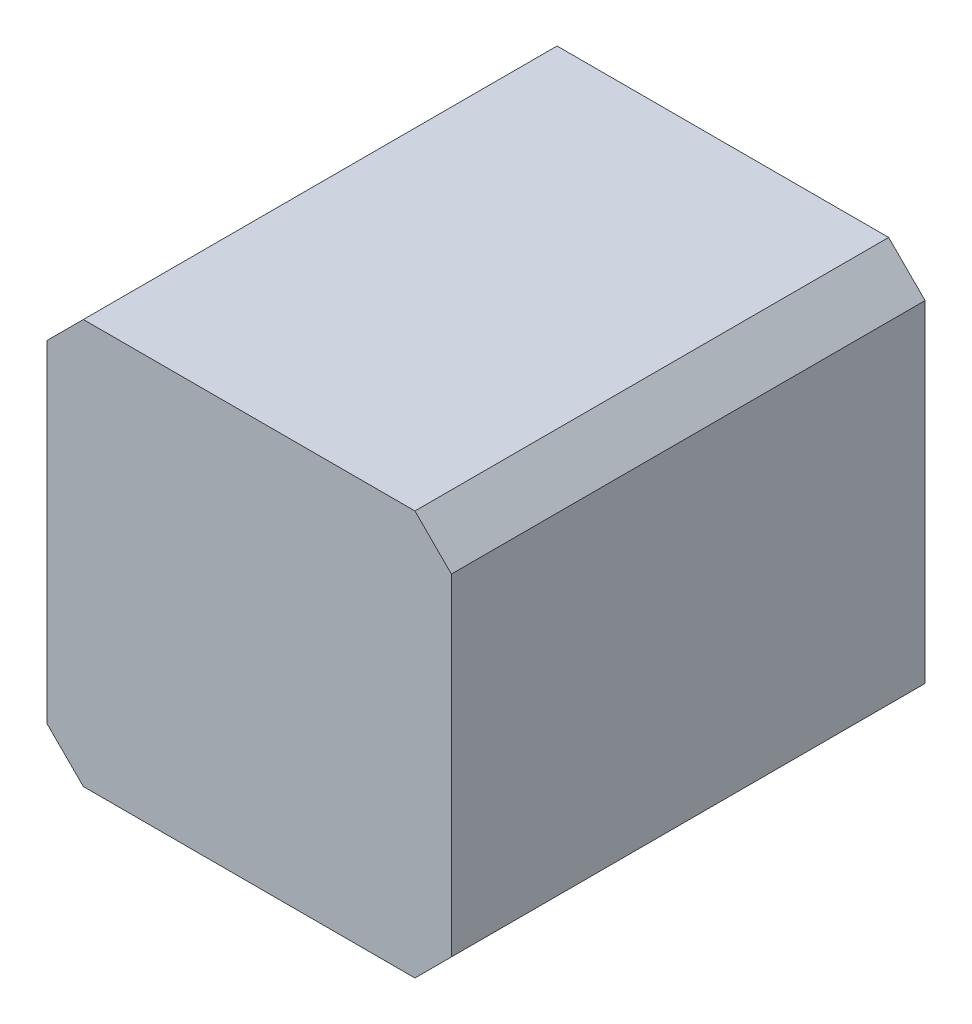
ISO-10303-21;
HEADER;
FILE_DESCRIPTION(('STEP AP214'),'2;1');
FILE_NAME('part.step','',(''),(''),'','','');
FILE_SCHEMA(('AUTOMOTIVE_DESIGN { 1 0 10303 214 1 1 1 1 }'));
ENDSEC;
DATA;
#1=APPLICATION_CONTEXT('core data for automotive mechanical design processes');
#2=APPLICATION_PROTOCOL_DEFINITION('international standard','automotive_design',2000,#1);
#3=PRODUCT_CONTEXT('',#1,'mechanical');
#4=PRODUCT('Part','Part','',(#3));
#5=PRODUCT_RELATED_PRODUCT_CATEGORY('part','',(#4));
#6=PRODUCT_DEFINITION_FORMATION('','',#4);
#7=PRODUCT_DEFINITION_CONTEXT('part definition',#1,'design');
#8=PRODUCT_DEFINITION('design','',#6,#7);
#9=PRODUCT_DEFINITION_SHAPE('','',#8);
#10=(LENGTH_UNIT() NAMED_UNIT(*) SI_UNIT(.MILLI.,.METRE.));
#11=(NAMED_UNIT(*) PLANE_ANGLE_UNIT() SI_UNIT($,.RADIAN.));
#12=(NAMED_UNIT(*) SI_UNIT($,.STERADIAN.) SOLID_ANGLE_UNIT());
#13=UNCERTAINTY_MEASURE_WITH_UNIT(LENGTH_MEASURE(1.E-05),#10,'distance_accuracy_value','');
#14=(GEOMETRIC_REPRESENTATION_CONTEXT(3) GLOBAL_UNCERTAINTY_ASSIGNED_CONTEXT((#13)) GLOBAL_UNIT_ASSIGNED_CONTEXT((#10,
#11,#12)) REPRESENTATION_CONTEXT('',''));
#15=CARTESIAN_POINT('',(0.,0.,0.));
#16=DIRECTION('',(0.,0.,1.));
#17=DIRECTION('',(1.,0.,0.));
#18=AXIS2_PLACEMENT_3D('',#15,#16,#17);
#19=CARTESIAN_POINT('',(-14.097,-14.097,33.02));
#20=DIRECTION('',(1.,0.,0.));
#21=DIRECTION('',(0.,0.,-1.));
#22=AXIS2_PLACEMENT_3D('',#19,#20,#21);
#23=PLANE('',#22);
#24=DIRECTION('',(0.,-1.,0.));
#25=VECTOR('',#24,1.);
#26=CARTESIAN_POINT('',(-14.097,-14.097,33.02));
#27=LINE('',#26,#25);
#28=CARTESIAN_POINT('',(-14.097,11.557,33.02));
#29=VERTEX_POINT('',#28);
#30=CARTESIAN_POINT('',(-14.097,-11.557,33.02));
#31=VERTEX_POINT('',#30);
#32=EDGE_CURVE('E134',#29,#31,#27,.T.);
#33=ORIENTED_EDGE('',*,*,#32,.F.);
#34=DIRECTION('',(0.,0.,-1.));
#35=VECTOR('',#34,1.);
#36=CARTESIAN_POINT('',(-14.097,11.557,33.02));
#37=LINE('',#36,#35);
#38=CARTESIAN_POINT('',(-14.097,11.557,0.));
#39=VERTEX_POINT('',#38);
#40=EDGE_CURVE('E161',#29,#39,#37,.T.);
#41=ORIENTED_EDGE('',*,*,#40,.T.);
#42=DIRECTION('',(0.,-1.,0.));
#43=VECTOR('',#42,1.);
#44=CARTESIAN_POINT('',(-14.097,-14.097,0.));
#45=LINE('',#44,#43);
#46=CARTESIAN_POINT('',(-14.097,-11.557,0.));
#47=VERTEX_POINT('',#46);
#48=EDGE_CURVE('E167',#39,#47,#45,.T.);
#49=ORIENTED_EDGE('',*,*,#48,.T.);
#50=DIRECTION('',(0.,0.,1.));
#51=VECTOR('',#50,1.);
#52=CARTESIAN_POINT('',(-14.097,-11.557,33.02));
#53=LINE('',#52,#51);
#54=EDGE_CURVE('E159',#47,#31,#53,.T.);
#55=ORIENTED_EDGE('',*,*,#54,.T.);
#56=EDGE_LOOP('',(#33,#41,#49,#55));
#57=FACE_BOUND('',#56,.T.);
#58=ADVANCED_FACE('F41',(#57),#23,.F.);
#59=CARTESIAN_POINT('',(14.097,-14.097,33.02));
#60=DIRECTION('',(0.,1.,0.));
#61=DIRECTION('',(-1.,0.,0.));
#62=AXIS2_PLACEMENT_3D('',#59,#60,#61);
#63=PLANE('',#62);
#64=DIRECTION('',(1.,0.,0.));
#65=VECTOR('',#64,1.);
#66=CARTESIAN_POINT('',(14.097,-14.097,33.02));
#67=LINE('',#66,#65);
#68=CARTESIAN_POINT('',(-11.557,-14.097,33.02));
#69=VERTEX_POINT('',#68);
#70=CARTESIAN_POINT('',(11.557,-14.097,33.02));
#71=VERTEX_POINT('',#70);
#72=EDGE_CURVE('E137',#69,#71,#67,.T.);
#73=ORIENTED_EDGE('',*,*,#72,.F.);
#74=DIRECTION('',(0.,0.,-1.));
#75=VECTOR('',#74,1.);
#76=CARTESIAN_POINT('',(-11.557,-14.097,33.02));
#77=LINE('',#76,#75);
#78=CARTESIAN_POINT('',(-11.557,-14.097,0.));
#79=VERTEX_POINT('',#78);
#80=EDGE_CURVE('E11',#69,#79,#77,.T.);
#81=ORIENTED_EDGE('',*,*,#80,.T.);
#82=DIRECTION('',(1.,0.,0.));
#83=VECTOR('',#82,1.);
#84=CARTESIAN_POINT('',(14.097,-14.097,0.));
#85=LINE('',#84,#83);
#86=CARTESIAN_POINT('',(11.557,-14.097,0.));
#87=VERTEX_POINT('',#86);
#88=EDGE_CURVE('E139',#79,#87,#85,.T.);
#89=ORIENTED_EDGE('',*,*,#88,.T.);
#90=DIRECTION('',(0.,0.,1.));
#91=VECTOR('',#90,1.);
#92=CARTESIAN_POINT('',(11.557,-14.097,33.02));
#93=LINE('',#92,#91);
#94=EDGE_CURVE('E50',#87,#71,#93,.T.);
#95=ORIENTED_EDGE('',*,*,#94,.T.);
#96=EDGE_LOOP('',(#73,#81,#89,#95));
#97=FACE_BOUND('',#96,.T.);
#98=ADVANCED_FACE('F221',(#97),#63,.F.);
#99=CARTESIAN_POINT('',(14.097,-14.097,33.02));
#100=DIRECTION('',(-1.,0.,0.));
#101=DIRECTION('',(0.,0.,1.));
#102=AXIS2_PLACEMENT_3D('',#99,#100,#101);
#103=PLANE('',#102);
#104=DIRECTION('',(0.,1.,0.));
#105=VECTOR('',#104,1.);
#106=CARTESIAN_POINT('',(14.097,-14.097,0.));
#107=LINE('',#106,#105);
#108=CARTESIAN_POINT('',(14.097,-11.557,0.));
#109=VERTEX_POINT('',#108);
#110=CARTESIAN_POINT('',(14.097,11.557,0.));
#111=VERTEX_POINT('',#110);
#112=EDGE_CURVE('E135',#109,#111,#107,.T.);
#113=ORIENTED_EDGE('',*,*,#112,.T.);
#114=DIRECTION('',(0.,0.,1.));
#115=VECTOR('',#114,1.);
#116=CARTESIAN_POINT('',(14.097,11.557,33.02));
#117=LINE('',#116,#115);
#118=CARTESIAN_POINT('',(14.097,11.557,33.02));
#119=VERTEX_POINT('',#118);
#120=EDGE_CURVE('E113',#111,#119,#117,.T.);
#121=ORIENTED_EDGE('',*,*,#120,.T.);
#122=DIRECTION('',(0.,1.,0.));
#123=VECTOR('',#122,1.);
#124=CARTESIAN_POINT('',(14.097,-14.097,33.02));
#125=LINE('',#124,#123);
#126=CARTESIAN_POINT('',(14.097,-11.557,33.02));
#127=VERTEX_POINT('',#126);
#128=EDGE_CURVE('E179',#127,#119,#125,.T.);
#129=ORIENTED_EDGE('',*,*,#128,.F.);
#130=DIRECTION('',(0.,0.,-1.));
#131=VECTOR('',#130,1.);
#132=CARTESIAN_POINT('',(14.097,-11.557,33.02));
#133=LINE('',#132,#131);
#134=EDGE_CURVE('E118',#127,#109,#133,.T.);
#135=ORIENTED_EDGE('',*,*,#134,.T.);
#136=EDGE_LOOP('',(#113,#121,#129,#135));
#137=FACE_BOUND('',#136,.T.);
#138=ADVANCED_FACE('F227',(#137),#103,.F.);
#139=CARTESIAN_POINT('',(14.097,14.097,33.02));
#140=DIRECTION('',(0.,-1.,0.));
#141=DIRECTION('',(1.,0.,0.));
#142=AXIS2_PLACEMENT_3D('',#139,#140,#141);
#143=PLANE('',#142);
#144=DIRECTION('',(-1.,0.,0.));
#145=VECTOR('',#144,1.);
#146=CARTESIAN_POINT('',(14.097,14.097,33.02));
#147=LINE('',#146,#145);
#148=CARTESIAN_POINT('',(11.557,14.097,33.02));
#149=VERTEX_POINT('',#148);
#150=CARTESIAN_POINT('',(-11.557,14.097,33.02));
#151=VERTEX_POINT('',#150);
#152=EDGE_CURVE('E128',#149,#151,#147,.T.);
#153=ORIENTED_EDGE('',*,*,#152,.F.);
#154=DIRECTION('',(0.,0.,-1.));
#155=VECTOR('',#154,1.);
#156=CARTESIAN_POINT('',(11.557,14.097,33.02));
#157=LINE('',#156,#155);
#158=CARTESIAN_POINT('',(11.557,14.097,0.));
#159=VERTEX_POINT('',#158);
#160=EDGE_CURVE('E112',#149,#159,#157,.T.);
#161=ORIENTED_EDGE('',*,*,#160,.T.);
#162=DIRECTION('',(-1.,0.,0.));
#163=VECTOR('',#162,1.);
#164=CARTESIAN_POINT('',(14.097,14.097,0.));
#165=LINE('',#164,#163);
#166=CARTESIAN_POINT('',(-11.557,14.097,0.));
#167=VERTEX_POINT('',#166);
#168=EDGE_CURVE('E125',#159,#167,#165,.T.);
#169=ORIENTED_EDGE('',*,*,#168,.T.);
#170=DIRECTION('',(0.,0.,1.));
#171=VECTOR('',#170,1.);
#172=CARTESIAN_POINT('',(-11.557,14.097,33.02));
#173=LINE('',#172,#171);
#174=EDGE_CURVE('E130',#167,#151,#173,.T.);
#175=ORIENTED_EDGE('',*,*,#174,.T.);
#176=EDGE_LOOP('',(#153,#161,#169,#175));
#177=FACE_BOUND('',#176,.T.);
#178=ADVANCED_FACE('F124',(#177),#143,.F.);
#179=CARTESIAN_POINT('',(0.,0.,33.02));
#180=DIRECTION('',(0.,0.,1.));
#181=DIRECTION('',(1.,0.,0.));
#182=AXIS2_PLACEMENT_3D('',#179,#180,#181);
#183=PLANE('',#182);
#184=ORIENTED_EDGE('',*,*,#128,.T.);
#185=DIRECTION('',(0.707106781186546,-0.70710678118655,0.));
#186=VECTOR('',#185,1.);
#187=CARTESIAN_POINT('',(12.827,12.827,33.02));
#188=LINE('',#187,#186);
#189=EDGE_CURVE('E157',#119,#149,#188,.F.);
#190=ORIENTED_EDGE('',*,*,#189,.T.);
#191=ORIENTED_EDGE('',*,*,#152,.T.);
#192=DIRECTION('',(0.70710678118655,0.707106781186546,0.));
#193=VECTOR('',#192,1.);
#194=CARTESIAN_POINT('',(-12.827,12.827,33.02));
#195=LINE('',#194,#193);
#196=EDGE_CURVE('E155',#151,#29,#195,.F.);
#197=ORIENTED_EDGE('',*,*,#196,.T.);
#198=ORIENTED_EDGE('',*,*,#32,.T.);
#199=DIRECTION('',(-0.707106781186547,0.707106781186548,0.));
#200=VECTOR('',#199,1.);
#201=CARTESIAN_POINT('',(-12.827,-12.827,33.02));
#202=LINE('',#201,#200);
#203=EDGE_CURVE('E63',#31,#69,#202,.F.);
#204=ORIENTED_EDGE('',*,*,#203,.T.);
#205=ORIENTED_EDGE('',*,*,#72,.T.);
#206=DIRECTION('',(-0.70710678118655,-0.707106781186546,0.));
#207=VECTOR('',#206,1.);
#208=CARTESIAN_POINT('',(12.827,-12.827,33.02));
#209=LINE('',#208,#207);
#210=EDGE_CURVE('E152',#71,#127,#209,.F.);
#211=ORIENTED_EDGE('',*,*,#210,.T.);
#212=EDGE_LOOP('',(#184,#190,#191,#197,#198,#204,#205,#211));
#213=FACE_BOUND('',#212,.T.);
#214=ADVANCED_FACE('F212',(#213),#183,.T.);
#215=CARTESIAN_POINT('',(0.,0.,0.));
#216=DIRECTION('',(0.,0.,1.));
#217=DIRECTION('',(1.,0.,0.));
#218=AXIS2_PLACEMENT_3D('',#215,#216,#217);
#219=PLANE('',#218);
#220=CARTESIAN_POINT('',(0.,0.,0.));
#221=DIRECTION('',(0.,0.,-1.));
#222=DIRECTION('',(-1.,0.,0.));
#223=AXIS2_PLACEMENT_3D('',#220,#221,#222);
#224=CIRCLE('',#223,10.9982);
#225=CARTESIAN_POINT('',(-10.9982,0.,0.));
#226=VERTEX_POINT('',#225);
#227=EDGE_CURVE('E143',#226,#226,#224,.T.);
#228=ORIENTED_EDGE('',*,*,#227,.F.);
#229=EDGE_LOOP('',(#228));
#230=FACE_BOUND('',#229,.T.);
#231=ORIENTED_EDGE('',*,*,#168,.F.);
#232=DIRECTION('',(-0.707106781186546,0.70710678118655,0.));
#233=VECTOR('',#232,1.);
#234=CARTESIAN_POINT('',(11.557,14.097,0.));
#235=LINE('',#234,#233);
#236=EDGE_CURVE('E108',#159,#111,#235,.F.);
#237=ORIENTED_EDGE('',*,*,#236,.T.);
#238=ORIENTED_EDGE('',*,*,#112,.F.);
#239=DIRECTION('',(0.70710678118655,0.707106781186546,0.));
#240=VECTOR('',#239,1.);
#241=CARTESIAN_POINT('',(14.097,-11.557,0.));
#242=LINE('',#241,#240);
#243=EDGE_CURVE('E129',#109,#87,#242,.F.);
#244=ORIENTED_EDGE('',*,*,#243,.T.);
#245=ORIENTED_EDGE('',*,*,#88,.F.);
#246=DIRECTION('',(0.707106781186547,-0.707106781186548,0.));
#247=VECTOR('',#246,1.);
#248=CARTESIAN_POINT('',(-11.557,-14.097,0.));
#249=LINE('',#248,#247);
#250=EDGE_CURVE('E146',#79,#47,#249,.F.);
#251=ORIENTED_EDGE('',*,*,#250,.T.);
#252=ORIENTED_EDGE('',*,*,#48,.F.);
#253=DIRECTION('',(-0.70710678118655,-0.707106781186546,0.));
#254=VECTOR('',#253,1.);
#255=CARTESIAN_POINT('',(-14.097,11.557,0.));
#256=LINE('',#255,#254);
#257=EDGE_CURVE('E119',#39,#167,#256,.F.);
#258=ORIENTED_EDGE('',*,*,#257,.T.);
#259=EDGE_LOOP('',(#231,#237,#238,#244,#245,#251,#252,#258));
#260=FACE_BOUND('',#259,.T.);
#261=ADVANCED_FACE('F132',(#230,#260),#219,.F.);
#262=CARTESIAN_POINT('',(0.,0.,-1.778));
#263=DIRECTION('',(0.,0.,1.));
#264=DIRECTION('',(1.,0.,0.));
#265=AXIS2_PLACEMENT_3D('',#262,#263,#264);
#266=CYLINDRICAL_SURFACE('',#265,10.9982);
#267=CARTESIAN_POINT('',(0.,0.,-1.778));
#268=DIRECTION('',(0.,0.,-1.));
#269=DIRECTION('',(-1.,0.,0.));
#270=AXIS2_PLACEMENT_3D('',#267,#268,#269);
#271=CIRCLE('',#270,10.9982);
#272=CARTESIAN_POINT('',(-10.9982,0.,-1.778));
#273=VERTEX_POINT('',#272);
#274=EDGE_CURVE('E172',#273,#273,#271,.T.);
#275=ORIENTED_EDGE('',*,*,#274,.F.);
#276=EDGE_LOOP('',(#275));
#277=FACE_BOUND('',#276,.T.);
#278=ORIENTED_EDGE('',*,*,#227,.T.);
#279=EDGE_LOOP('',(#278));
#280=FACE_BOUND('',#279,.T.);
#281=ADVANCED_FACE('F202',(#277,#280),#266,.T.);
#282=CARTESIAN_POINT('',(0.,0.,-1.778));
#283=DIRECTION('',(0.,0.,-1.));
#284=DIRECTION('',(-1.,0.,0.));
#285=AXIS2_PLACEMENT_3D('',#282,#283,#284);
#286=PLANE('',#285);
#287=CARTESIAN_POINT('',(0.,0.,-1.778));
#288=DIRECTION('',(0.,0.,-1.));
#289=DIRECTION('',(-1.,0.,0.));
#290=AXIS2_PLACEMENT_3D('',#287,#288,#289);
#291=CIRCLE('',#290,3.175);
#292=CARTESIAN_POINT('',(-3.175,0.,-1.778));
#293=VERTEX_POINT('',#292);
#294=EDGE_CURVE('E185',#293,#293,#291,.T.);
#295=ORIENTED_EDGE('',*,*,#294,.F.);
#296=EDGE_LOOP('',(#295));
#297=FACE_BOUND('',#296,.T.);
#298=ORIENTED_EDGE('',*,*,#274,.T.);
#299=EDGE_LOOP('',(#298));
#300=FACE_BOUND('',#299,.T.);
#301=ADVANCED_FACE('F196',(#297,#300),#286,.T.);
#302=CARTESIAN_POINT('',(0.,0.,3.302));
#303=DIRECTION('',(0.,0.,-1.));
#304=DIRECTION('',(-1.,0.,0.));
#305=AXIS2_PLACEMENT_3D('',#302,#303,#304);
#306=CYLINDRICAL_SURFACE('',#305,3.175);
#307=CARTESIAN_POINT('',(0.,0.,3.302));
#308=DIRECTION('',(0.,0.,-1.));
#309=DIRECTION('',(-1.,0.,0.));
#310=AXIS2_PLACEMENT_3D('',#307,#308,#309);
#311=CIRCLE('',#310,3.175);
#312=CARTESIAN_POINT('',(-3.175,0.,3.302));
#313=VERTEX_POINT('',#312);
#314=EDGE_CURVE('E175',#313,#313,#311,.T.);
#315=ORIENTED_EDGE('',*,*,#314,.F.);
#316=EDGE_LOOP('',(#315));
#317=FACE_BOUND('',#316,.T.);
#318=ORIENTED_EDGE('',*,*,#294,.T.);
#319=EDGE_LOOP('',(#318));
#320=FACE_BOUND('',#319,.T.);
#321=ADVANCED_FACE('F193',(#317,#320),#306,.F.);
#322=CARTESIAN_POINT('',(0.,0.,3.302));
#323=DIRECTION('',(0.,0.,-1.));
#324=DIRECTION('',(-1.,0.,0.));
#325=AXIS2_PLACEMENT_3D('',#322,#323,#324);
#326=PLANE('',#325);
#327=ORIENTED_EDGE('',*,*,#314,.T.);
#328=EDGE_LOOP('',(#327));
#329=FACE_BOUND('',#328,.T.);
#330=ADVANCED_FACE('F191',(#329),#326,.T.);
#331=CARTESIAN_POINT('',(11.557,14.097,33.02));
#332=DIRECTION('',(-0.70710678118655,-0.707106781186546,0.));
#333=DIRECTION('',(0.,0.,-1.));
#334=AXIS2_PLACEMENT_3D('',#331,#332,#333);
#335=PLANE('',#334);
#336=ORIENTED_EDGE('',*,*,#189,.F.);
#337=ORIENTED_EDGE('',*,*,#120,.F.);
#338=ORIENTED_EDGE('',*,*,#236,.F.);
#339=ORIENTED_EDGE('',*,*,#160,.F.);
#340=EDGE_LOOP('',(#336,#337,#338,#339));
#341=FACE_BOUND('',#340,.T.);
#342=ADVANCED_FACE('F111',(#341),#335,.F.);
#343=CARTESIAN_POINT('',(-14.097,11.557,33.02));
#344=DIRECTION('',(0.707106781186546,-0.70710678118655,0.));
#345=DIRECTION('',(0.,0.,-1.));
#346=AXIS2_PLACEMENT_3D('',#343,#344,#345);
#347=PLANE('',#346);
#348=ORIENTED_EDGE('',*,*,#196,.F.);
#349=ORIENTED_EDGE('',*,*,#174,.F.);
#350=ORIENTED_EDGE('',*,*,#257,.F.);
#351=ORIENTED_EDGE('',*,*,#40,.F.);
#352=EDGE_LOOP('',(#348,#349,#350,#351));
#353=FACE_BOUND('',#352,.T.);
#354=ADVANCED_FACE('F236',(#353),#347,.F.);
#355=CARTESIAN_POINT('',(-11.557,-14.097,33.02));
#356=DIRECTION('',(0.707106781186548,0.707106781186547,0.));
#357=DIRECTION('',(0.,0.,-1.));
#358=AXIS2_PLACEMENT_3D('',#355,#356,#357);
#359=PLANE('',#358);
#360=ORIENTED_EDGE('',*,*,#203,.F.);
#361=ORIENTED_EDGE('',*,*,#54,.F.);
#362=ORIENTED_EDGE('',*,*,#250,.F.);
#363=ORIENTED_EDGE('',*,*,#80,.F.);
#364=EDGE_LOOP('',(#360,#361,#362,#363));
#365=FACE_BOUND('',#364,.T.);
#366=ADVANCED_FACE('F241',(#365),#359,.F.);
#367=CARTESIAN_POINT('',(14.097,-11.557,33.02));
#368=DIRECTION('',(-0.707106781186546,0.70710678118655,0.));
#369=DIRECTION('',(0.,0.,-1.));
#370=AXIS2_PLACEMENT_3D('',#367,#368,#369);
#371=PLANE('',#370);
#372=ORIENTED_EDGE('',*,*,#210,.F.);
#373=ORIENTED_EDGE('',*,*,#94,.F.);
#374=ORIENTED_EDGE('',*,*,#243,.F.);
#375=ORIENTED_EDGE('',*,*,#134,.F.);
#376=EDGE_LOOP('',(#372,#373,#374,#375));
#377=FACE_BOUND('',#376,.T.);
#378=ADVANCED_FACE('F44',(#377),#371,.F.);
#379=CLOSED_SHELL('',(#58,#98,#138,#178,#214,#261,#281,#301,#321,#330,#342,#354,#366,#378));
#380=MANIFOLD_SOLID_BREP('B2',#379);
#381=ADVANCED_BREP_SHAPE_REPRESENTATION('',(#18,#380),#14);
#382=SHAPE_DEFINITION_REPRESENTATION(#9,#381);
ENDSEC;
END-ISO-10303-21;
